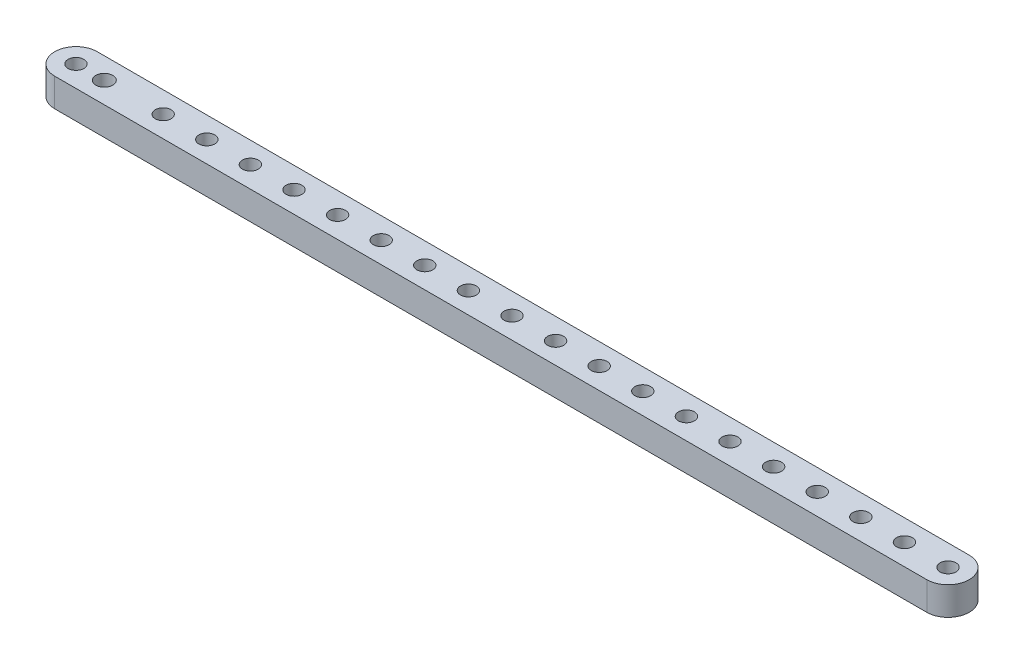
ISO-10303-21;
HEADER;
FILE_DESCRIPTION(('STEP AP214'),'2;1');
FILE_NAME('part.step','',(''),(''),'','','');
FILE_SCHEMA(('AUTOMOTIVE_DESIGN { 1 0 10303 214 1 1 1 1 }'));
ENDSEC;
DATA;
#1=APPLICATION_CONTEXT('core data for automotive mechanical design processes');
#2=APPLICATION_PROTOCOL_DEFINITION('international standard','automotive_design',2000,#1);
#3=PRODUCT_CONTEXT('',#1,'mechanical');
#4=PRODUCT('Part','Part','',(#3));
#5=PRODUCT_RELATED_PRODUCT_CATEGORY('part','',(#4));
#6=PRODUCT_DEFINITION_FORMATION('','',#4);
#7=PRODUCT_DEFINITION_CONTEXT('part definition',#1,'design');
#8=PRODUCT_DEFINITION('design','',#6,#7);
#9=PRODUCT_DEFINITION_SHAPE('','',#8);
#10=(LENGTH_UNIT() NAMED_UNIT(*) SI_UNIT(.MILLI.,.METRE.));
#11=(NAMED_UNIT(*) PLANE_ANGLE_UNIT() SI_UNIT($,.RADIAN.));
#12=(NAMED_UNIT(*) SI_UNIT($,.STERADIAN.) SOLID_ANGLE_UNIT());
#13=UNCERTAINTY_MEASURE_WITH_UNIT(LENGTH_MEASURE(1.E-05),#10,'distance_accuracy_value','');
#14=(GEOMETRIC_REPRESENTATION_CONTEXT(3) GLOBAL_UNCERTAINTY_ASSIGNED_CONTEXT((#13)) GLOBAL_UNIT_ASSIGNED_CONTEXT((#10,
#11,#12)) REPRESENTATION_CONTEXT('',''));
#15=CARTESIAN_POINT('',(0.,0.,0.));
#16=DIRECTION('',(0.,0.,1.));
#17=DIRECTION('',(1.,0.,0.));
#18=AXIS2_PLACEMENT_3D('',#15,#16,#17);
#19=CARTESIAN_POINT('',(97.79,0.,0.));
#20=DIRECTION('',(0.,1.,0.));
#21=DIRECTION('',(0.,0.,1.));
#22=AXIS2_PLACEMENT_3D('',#19,#20,#21);
#23=CYLINDRICAL_SURFACE('',#22,4.76250000000002);
#24=CARTESIAN_POINT('',(97.79,6.35,0.));
#25=DIRECTION('',(0.,1.,0.));
#26=DIRECTION('',(0.,0.,1.));
#27=AXIS2_PLACEMENT_3D('',#24,#25,#26);
#28=CIRCLE('',#27,4.76250000000002);
#29=CARTESIAN_POINT('',(97.79,6.35,4.76250000000003));
#30=VERTEX_POINT('',#29);
#31=CARTESIAN_POINT('',(97.79,6.35,-4.76250000000002));
#32=VERTEX_POINT('',#31);
#33=EDGE_CURVE('E110',#30,#32,#28,.T.);
#34=ORIENTED_EDGE('',*,*,#33,.F.);
#35=DIRECTION('',(0.,1.,0.));
#36=VECTOR('',#35,1.);
#37=CARTESIAN_POINT('',(97.79,0.,4.76250000000003));
#38=LINE('',#37,#36);
#39=CARTESIAN_POINT('',(97.79,0.,4.76250000000003));
#40=VERTEX_POINT('',#39);
#41=EDGE_CURVE('E11',#40,#30,#38,.T.);
#42=ORIENTED_EDGE('',*,*,#41,.F.);
#43=CARTESIAN_POINT('',(97.79,0.,0.));
#44=DIRECTION('',(0.,1.,0.));
#45=DIRECTION('',(0.,0.,1.));
#46=AXIS2_PLACEMENT_3D('',#43,#44,#45);
#47=CIRCLE('',#46,4.76250000000002);
#48=CARTESIAN_POINT('',(97.79,0.,-4.76250000000002));
#49=VERTEX_POINT('',#48);
#50=EDGE_CURVE('E101',#40,#49,#47,.T.);
#51=ORIENTED_EDGE('',*,*,#50,.T.);
#52=DIRECTION('',(0.,1.,0.));
#53=VECTOR('',#52,1.);
#54=CARTESIAN_POINT('',(97.79,0.,-4.76250000000002));
#55=LINE('',#54,#53);
#56=EDGE_CURVE('E42',#49,#32,#55,.T.);
#57=ORIENTED_EDGE('',*,*,#56,.T.);
#58=EDGE_LOOP('',(#34,#42,#51,#57));
#59=FACE_BOUND('',#58,.T.);
#60=ADVANCED_FACE('F39',(#59),#23,.T.);
#61=CARTESIAN_POINT('',(-97.79,0.,4.76250000000003));
#62=DIRECTION('',(0.,0.,1.));
#63=DIRECTION('',(1.,0.,0.));
#64=AXIS2_PLACEMENT_3D('',#61,#62,#63);
#65=PLANE('',#64);
#66=DIRECTION('',(1.,0.,0.));
#67=VECTOR('',#66,1.);
#68=CARTESIAN_POINT('',(-97.79,6.35,4.76250000000003));
#69=LINE('',#68,#67);
#70=CARTESIAN_POINT('',(-97.79,6.35,4.76250000000003));
#71=VERTEX_POINT('',#70);
#72=EDGE_CURVE('E104',#71,#30,#69,.T.);
#73=ORIENTED_EDGE('',*,*,#72,.F.);
#74=DIRECTION('',(0.,1.,0.));
#75=VECTOR('',#74,1.);
#76=CARTESIAN_POINT('',(-97.79,0.,4.76250000000003));
#77=LINE('',#76,#75);
#78=CARTESIAN_POINT('',(-97.79,0.,4.76250000000003));
#79=VERTEX_POINT('',#78);
#80=EDGE_CURVE('E49',#79,#71,#77,.T.);
#81=ORIENTED_EDGE('',*,*,#80,.F.);
#82=DIRECTION('',(1.,0.,0.));
#83=VECTOR('',#82,1.);
#84=CARTESIAN_POINT('',(-97.79,0.,4.76250000000003));
#85=LINE('',#84,#83);
#86=EDGE_CURVE('E96',#79,#40,#85,.T.);
#87=ORIENTED_EDGE('',*,*,#86,.T.);
#88=ORIENTED_EDGE('',*,*,#41,.T.);
#89=EDGE_LOOP('',(#73,#81,#87,#88));
#90=FACE_BOUND('',#89,.T.);
#91=ADVANCED_FACE('F127',(#90),#65,.T.);
#92=CARTESIAN_POINT('',(-97.79,0.,0.));
#93=DIRECTION('',(0.,1.,0.));
#94=DIRECTION('',(0.,0.,1.));
#95=AXIS2_PLACEMENT_3D('',#92,#93,#94);
#96=CYLINDRICAL_SURFACE('',#95,4.76250000000002);
#97=CARTESIAN_POINT('',(-97.79,6.35,0.));
#98=DIRECTION('',(0.,1.,0.));
#99=DIRECTION('',(0.,0.,1.));
#100=AXIS2_PLACEMENT_3D('',#97,#98,#99);
#101=CIRCLE('',#100,4.76250000000002);
#102=CARTESIAN_POINT('',(-97.79,6.35,-4.7625));
#103=VERTEX_POINT('',#102);
#104=EDGE_CURVE('E90',#103,#71,#101,.T.);
#105=ORIENTED_EDGE('',*,*,#104,.F.);
#106=DIRECTION('',(0.,1.,0.));
#107=VECTOR('',#106,1.);
#108=CARTESIAN_POINT('',(-97.79,0.,-4.7625));
#109=LINE('',#108,#107);
#110=CARTESIAN_POINT('',(-97.79,0.,-4.7625));
#111=VERTEX_POINT('',#110);
#112=EDGE_CURVE('E85',#111,#103,#109,.T.);
#113=ORIENTED_EDGE('',*,*,#112,.F.);
#114=CARTESIAN_POINT('',(-97.79,0.,0.));
#115=DIRECTION('',(0.,1.,0.));
#116=DIRECTION('',(0.,0.,1.));
#117=AXIS2_PLACEMENT_3D('',#114,#115,#116);
#118=CIRCLE('',#117,4.76250000000002);
#119=EDGE_CURVE('E88',#111,#79,#118,.T.);
#120=ORIENTED_EDGE('',*,*,#119,.T.);
#121=ORIENTED_EDGE('',*,*,#80,.T.);
#122=EDGE_LOOP('',(#105,#113,#120,#121));
#123=FACE_BOUND('',#122,.T.);
#124=ADVANCED_FACE('F87',(#123),#96,.T.);
#125=CARTESIAN_POINT('',(97.79,0.,-4.76250000000002));
#126=DIRECTION('',(0.,0.,-1.));
#127=DIRECTION('',(-1.,0.,0.));
#128=AXIS2_PLACEMENT_3D('',#125,#126,#127);
#129=PLANE('',#128);
#130=DIRECTION('',(-1.,0.,0.));
#131=VECTOR('',#130,1.);
#132=CARTESIAN_POINT('',(97.79,6.35,-4.76250000000002));
#133=LINE('',#132,#131);
#134=EDGE_CURVE('E114',#32,#103,#133,.T.);
#135=ORIENTED_EDGE('',*,*,#134,.F.);
#136=ORIENTED_EDGE('',*,*,#56,.F.);
#137=DIRECTION('',(-1.,0.,0.));
#138=VECTOR('',#137,1.);
#139=CARTESIAN_POINT('',(97.79,0.,-4.76250000000002));
#140=LINE('',#139,#138);
#141=EDGE_CURVE('E95',#49,#111,#140,.T.);
#142=ORIENTED_EDGE('',*,*,#141,.T.);
#143=ORIENTED_EDGE('',*,*,#112,.T.);
#144=EDGE_LOOP('',(#135,#136,#142,#143));
#145=FACE_BOUND('',#144,.T.);
#146=ADVANCED_FACE('F99',(#145),#129,.T.);
#147=CARTESIAN_POINT('',(97.79,0.,0.));
#148=DIRECTION('',(0.,1.,0.));
#149=DIRECTION('',(0.,0.,1.));
#150=AXIS2_PLACEMENT_3D('',#147,#148,#149);
#151=PLANE('',#150);
#152=CARTESIAN_POINT('',(-91.44,0.,0.));
#153=DIRECTION('',(0.,1.,0.));
#154=DIRECTION('',(0.,0.,1.));
#155=AXIS2_PLACEMENT_3D('',#152,#153,#154);
#156=CIRCLE('',#155,1.90500000000001);
#157=CARTESIAN_POINT('',(-91.44,0.,1.90500000000001));
#158=VERTEX_POINT('',#157);
#159=EDGE_CURVE('E236',#158,#158,#156,.T.);
#160=ORIENTED_EDGE('',*,*,#159,.T.);
#161=EDGE_LOOP('',(#160));
#162=FACE_BOUND('',#161,.T.);
#163=CARTESIAN_POINT('',(-97.79,0.,0.));
#164=DIRECTION('',(0.,1.,0.));
#165=DIRECTION('',(0.,0.,-1.));
#166=AXIS2_PLACEMENT_3D('',#163,#164,#165);
#167=CIRCLE('',#166,1.77799999999997);
#168=CARTESIAN_POINT('',(-97.79,0.,-1.77799999999995));
#169=VERTEX_POINT('',#168);
#170=EDGE_CURVE('E246',#169,#169,#167,.T.);
#171=ORIENTED_EDGE('',*,*,#170,.T.);
#172=EDGE_LOOP('',(#171));
#173=FACE_BOUND('',#172,.T.);
#174=CARTESIAN_POINT('',(-78.232,0.,0.));
#175=DIRECTION('',(0.,1.,0.));
#176=DIRECTION('',(0.,0.,-1.));
#177=AXIS2_PLACEMENT_3D('',#174,#175,#176);
#178=CIRCLE('',#177,1.77799999999999);
#179=CARTESIAN_POINT('',(-78.232,0.,-1.77799999999999));
#180=VERTEX_POINT('',#179);
#181=EDGE_CURVE('E254',#180,#180,#178,.T.);
#182=ORIENTED_EDGE('',*,*,#181,.T.);
#183=EDGE_LOOP('',(#182));
#184=FACE_BOUND('',#183,.T.);
#185=CARTESIAN_POINT('',(-68.453,0.,0.));
#186=DIRECTION('',(0.,1.,0.));
#187=DIRECTION('',(0.,0.,-1.));
#188=AXIS2_PLACEMENT_3D('',#185,#186,#187);
#189=CIRCLE('',#188,1.77799999999999);
#190=CARTESIAN_POINT('',(-68.453,0.,-1.77799999999999));
#191=VERTEX_POINT('',#190);
#192=EDGE_CURVE('E262',#191,#191,#189,.T.);
#193=ORIENTED_EDGE('',*,*,#192,.T.);
#194=EDGE_LOOP('',(#193));
#195=FACE_BOUND('',#194,.T.);
#196=CARTESIAN_POINT('',(-58.674,0.,0.));
#197=DIRECTION('',(0.,1.,0.));
#198=DIRECTION('',(0.,0.,-1.));
#199=AXIS2_PLACEMENT_3D('',#196,#197,#198);
#200=CIRCLE('',#199,1.77799999999999);
#201=CARTESIAN_POINT('',(-58.674,0.,-1.77799999999998));
#202=VERTEX_POINT('',#201);
#203=EDGE_CURVE('E270',#202,#202,#200,.T.);
#204=ORIENTED_EDGE('',*,*,#203,.T.);
#205=EDGE_LOOP('',(#204));
#206=FACE_BOUND('',#205,.T.);
#207=CARTESIAN_POINT('',(-48.895,0.,0.));
#208=DIRECTION('',(0.,1.,0.));
#209=DIRECTION('',(0.,0.,-1.));
#210=AXIS2_PLACEMENT_3D('',#207,#208,#209);
#211=CIRCLE('',#210,1.77799999999999);
#212=CARTESIAN_POINT('',(-48.895,0.,-1.77799999999998));
#213=VERTEX_POINT('',#212);
#214=EDGE_CURVE('E278',#213,#213,#211,.T.);
#215=ORIENTED_EDGE('',*,*,#214,.T.);
#216=EDGE_LOOP('',(#215));
#217=FACE_BOUND('',#216,.T.);
#218=CARTESIAN_POINT('',(-39.116,0.,0.));
#219=DIRECTION('',(0.,1.,0.));
#220=DIRECTION('',(0.,0.,-1.));
#221=AXIS2_PLACEMENT_3D('',#218,#219,#220);
#222=CIRCLE('',#221,1.77799999999999);
#223=CARTESIAN_POINT('',(-39.116,0.,-1.77799999999998));
#224=VERTEX_POINT('',#223);
#225=EDGE_CURVE('E286',#224,#224,#222,.T.);
#226=ORIENTED_EDGE('',*,*,#225,.T.);
#227=EDGE_LOOP('',(#226));
#228=FACE_BOUND('',#227,.T.);
#229=CARTESIAN_POINT('',(-29.337,0.,0.));
#230=DIRECTION('',(0.,1.,0.));
#231=DIRECTION('',(0.,0.,-1.));
#232=AXIS2_PLACEMENT_3D('',#229,#230,#231);
#233=CIRCLE('',#232,1.77799999999999);
#234=CARTESIAN_POINT('',(-29.337,0.,-1.77799999999998));
#235=VERTEX_POINT('',#234);
#236=EDGE_CURVE('E294',#235,#235,#233,.T.);
#237=ORIENTED_EDGE('',*,*,#236,.T.);
#238=EDGE_LOOP('',(#237));
#239=FACE_BOUND('',#238,.T.);
#240=CARTESIAN_POINT('',(-19.558,0.,0.));
#241=DIRECTION('',(0.,1.,0.));
#242=DIRECTION('',(0.,0.,-1.));
#243=AXIS2_PLACEMENT_3D('',#240,#241,#242);
#244=CIRCLE('',#243,1.77799999999999);
#245=CARTESIAN_POINT('',(-19.558,0.,-1.77799999999998));
#246=VERTEX_POINT('',#245);
#247=EDGE_CURVE('E302',#246,#246,#244,.T.);
#248=ORIENTED_EDGE('',*,*,#247,.T.);
#249=EDGE_LOOP('',(#248));
#250=FACE_BOUND('',#249,.T.);
#251=CARTESIAN_POINT('',(-9.77900000000001,0.,0.));
#252=DIRECTION('',(0.,1.,0.));
#253=DIRECTION('',(0.,0.,-1.));
#254=AXIS2_PLACEMENT_3D('',#251,#252,#253);
#255=CIRCLE('',#254,1.77799999999999);
#256=CARTESIAN_POINT('',(-9.77900000000001,0.,-1.77799999999998));
#257=VERTEX_POINT('',#256);
#258=EDGE_CURVE('E310',#257,#257,#255,.T.);
#259=ORIENTED_EDGE('',*,*,#258,.T.);
#260=EDGE_LOOP('',(#259));
#261=FACE_BOUND('',#260,.T.);
#262=CARTESIAN_POINT('',(0.,0.,0.));
#263=DIRECTION('',(0.,1.,0.));
#264=DIRECTION('',(0.,0.,-1.));
#265=AXIS2_PLACEMENT_3D('',#262,#263,#264);
#266=CIRCLE('',#265,1.77799999999999);
#267=CARTESIAN_POINT('',(0.,0.,-1.77799999999998));
#268=VERTEX_POINT('',#267);
#269=EDGE_CURVE('E318',#268,#268,#266,.T.);
#270=ORIENTED_EDGE('',*,*,#269,.T.);
#271=EDGE_LOOP('',(#270));
#272=FACE_BOUND('',#271,.T.);
#273=CARTESIAN_POINT('',(9.779,0.,0.));
#274=DIRECTION('',(0.,1.,0.));
#275=DIRECTION('',(0.,0.,-1.));
#276=AXIS2_PLACEMENT_3D('',#273,#274,#275);
#277=CIRCLE('',#276,1.77799999999999);
#278=CARTESIAN_POINT('',(9.779,0.,-1.77799999999998));
#279=VERTEX_POINT('',#278);
#280=EDGE_CURVE('E326',#279,#279,#277,.T.);
#281=ORIENTED_EDGE('',*,*,#280,.T.);
#282=EDGE_LOOP('',(#281));
#283=FACE_BOUND('',#282,.T.);
#284=CARTESIAN_POINT('',(19.558,0.,0.));
#285=DIRECTION('',(0.,1.,0.));
#286=DIRECTION('',(0.,0.,-1.));
#287=AXIS2_PLACEMENT_3D('',#284,#285,#286);
#288=CIRCLE('',#287,1.77799999999999);
#289=CARTESIAN_POINT('',(19.558,0.,-1.77799999999998));
#290=VERTEX_POINT('',#289);
#291=EDGE_CURVE('E334',#290,#290,#288,.T.);
#292=ORIENTED_EDGE('',*,*,#291,.T.);
#293=EDGE_LOOP('',(#292));
#294=FACE_BOUND('',#293,.T.);
#295=CARTESIAN_POINT('',(29.337,0.,0.));
#296=DIRECTION('',(0.,1.,0.));
#297=DIRECTION('',(0.,0.,-1.));
#298=AXIS2_PLACEMENT_3D('',#295,#296,#297);
#299=CIRCLE('',#298,1.77799999999999);
#300=CARTESIAN_POINT('',(29.337,0.,-1.77799999999998));
#301=VERTEX_POINT('',#300);
#302=EDGE_CURVE('E342',#301,#301,#299,.T.);
#303=ORIENTED_EDGE('',*,*,#302,.T.);
#304=EDGE_LOOP('',(#303));
#305=FACE_BOUND('',#304,.T.);
#306=CARTESIAN_POINT('',(39.116,0.,0.));
#307=DIRECTION('',(0.,1.,0.));
#308=DIRECTION('',(0.,0.,-1.));
#309=AXIS2_PLACEMENT_3D('',#306,#307,#308);
#310=CIRCLE('',#309,1.77799999999999);
#311=CARTESIAN_POINT('',(39.116,0.,-1.77799999999998));
#312=VERTEX_POINT('',#311);
#313=EDGE_CURVE('E350',#312,#312,#310,.T.);
#314=ORIENTED_EDGE('',*,*,#313,.T.);
#315=EDGE_LOOP('',(#314));
#316=FACE_BOUND('',#315,.T.);
#317=CARTESIAN_POINT('',(48.895,0.,0.));
#318=DIRECTION('',(0.,1.,0.));
#319=DIRECTION('',(0.,0.,-1.));
#320=AXIS2_PLACEMENT_3D('',#317,#318,#319);
#321=CIRCLE('',#320,1.77799999999999);
#322=CARTESIAN_POINT('',(48.895,0.,-1.77799999999997));
#323=VERTEX_POINT('',#322);
#324=EDGE_CURVE('E358',#323,#323,#321,.T.);
#325=ORIENTED_EDGE('',*,*,#324,.T.);
#326=EDGE_LOOP('',(#325));
#327=FACE_BOUND('',#326,.T.);
#328=CARTESIAN_POINT('',(58.674,0.,0.));
#329=DIRECTION('',(0.,1.,0.));
#330=DIRECTION('',(0.,0.,-1.));
#331=AXIS2_PLACEMENT_3D('',#328,#329,#330);
#332=CIRCLE('',#331,1.77799999999999);
#333=CARTESIAN_POINT('',(58.674,0.,-1.77799999999997));
#334=VERTEX_POINT('',#333);
#335=EDGE_CURVE('E366',#334,#334,#332,.T.);
#336=ORIENTED_EDGE('',*,*,#335,.T.);
#337=EDGE_LOOP('',(#336));
#338=FACE_BOUND('',#337,.T.);
#339=CARTESIAN_POINT('',(68.453,0.,0.));
#340=DIRECTION('',(0.,1.,0.));
#341=DIRECTION('',(0.,0.,-1.));
#342=AXIS2_PLACEMENT_3D('',#339,#340,#341);
#343=CIRCLE('',#342,1.77799999999999);
#344=CARTESIAN_POINT('',(68.453,0.,-1.77799999999997));
#345=VERTEX_POINT('',#344);
#346=EDGE_CURVE('E374',#345,#345,#343,.T.);
#347=ORIENTED_EDGE('',*,*,#346,.T.);
#348=EDGE_LOOP('',(#347));
#349=FACE_BOUND('',#348,.T.);
#350=CARTESIAN_POINT('',(78.232,0.,0.));
#351=DIRECTION('',(0.,1.,0.));
#352=DIRECTION('',(0.,0.,-1.));
#353=AXIS2_PLACEMENT_3D('',#350,#351,#352);
#354=CIRCLE('',#353,1.77799999999999);
#355=CARTESIAN_POINT('',(78.232,0.,-1.77799999999997));
#356=VERTEX_POINT('',#355);
#357=EDGE_CURVE('E382',#356,#356,#354,.T.);
#358=ORIENTED_EDGE('',*,*,#357,.T.);
#359=EDGE_LOOP('',(#358));
#360=FACE_BOUND('',#359,.T.);
#361=CARTESIAN_POINT('',(88.011,0.,0.));
#362=DIRECTION('',(0.,1.,0.));
#363=DIRECTION('',(0.,0.,-1.));
#364=AXIS2_PLACEMENT_3D('',#361,#362,#363);
#365=CIRCLE('',#364,1.77799999999999);
#366=CARTESIAN_POINT('',(88.011,0.,-1.77799999999997));
#367=VERTEX_POINT('',#366);
#368=EDGE_CURVE('E390',#367,#367,#365,.T.);
#369=ORIENTED_EDGE('',*,*,#368,.T.);
#370=EDGE_LOOP('',(#369));
#371=FACE_BOUND('',#370,.T.);
#372=CARTESIAN_POINT('',(97.79,0.,0.));
#373=DIRECTION('',(0.,1.,0.));
#374=DIRECTION('',(0.,0.,-1.));
#375=AXIS2_PLACEMENT_3D('',#372,#373,#374);
#376=CIRCLE('',#375,1.77799999999999);
#377=CARTESIAN_POINT('',(97.79,0.,-1.77799999999997));
#378=VERTEX_POINT('',#377);
#379=EDGE_CURVE('E115',#378,#378,#376,.T.);
#380=ORIENTED_EDGE('',*,*,#379,.T.);
#381=EDGE_LOOP('',(#380));
#382=FACE_BOUND('',#381,.T.);
#383=ORIENTED_EDGE('',*,*,#50,.F.);
#384=ORIENTED_EDGE('',*,*,#86,.F.);
#385=ORIENTED_EDGE('',*,*,#119,.F.);
#386=ORIENTED_EDGE('',*,*,#141,.F.);
#387=EDGE_LOOP('',(#383,#384,#385,#386));
#388=FACE_BOUND('',#387,.T.);
#389=ADVANCED_FACE('F94',(#162,#173,#184,#195,#206,#217,#228,#239,#250,#261,#272,#283,#294,#305,
#316,#327,#338,#349,#360,#371,#382,#388),#151,.F.);
#390=CARTESIAN_POINT('',(97.79,6.35,0.));
#391=DIRECTION('',(0.,1.,0.));
#392=DIRECTION('',(0.,0.,1.));
#393=AXIS2_PLACEMENT_3D('',#390,#391,#392);
#394=PLANE('',#393);
#395=CARTESIAN_POINT('',(-91.44,6.35,0.));
#396=DIRECTION('',(0.,1.,0.));
#397=DIRECTION('',(0.,0.,1.));
#398=AXIS2_PLACEMENT_3D('',#395,#396,#397);
#399=CIRCLE('',#398,1.90500000000001);
#400=CARTESIAN_POINT('',(-91.44,6.35,1.90500000000001));
#401=VERTEX_POINT('',#400);
#402=EDGE_CURVE('E239',#401,#401,#399,.T.);
#403=ORIENTED_EDGE('',*,*,#402,.F.);
#404=EDGE_LOOP('',(#403));
#405=FACE_BOUND('',#404,.T.);
#406=CARTESIAN_POINT('',(-97.79,6.35,0.));
#407=DIRECTION('',(0.,1.,0.));
#408=DIRECTION('',(0.,0.,-1.));
#409=AXIS2_PLACEMENT_3D('',#406,#407,#408);
#410=CIRCLE('',#409,1.77799999999997);
#411=CARTESIAN_POINT('',(-97.79,6.35,-1.77799999999995));
#412=VERTEX_POINT('',#411);
#413=EDGE_CURVE('E243',#412,#412,#410,.T.);
#414=ORIENTED_EDGE('',*,*,#413,.F.);
#415=EDGE_LOOP('',(#414));
#416=FACE_BOUND('',#415,.T.);
#417=CARTESIAN_POINT('',(-78.232,6.35,0.));
#418=DIRECTION('',(0.,1.,0.));
#419=DIRECTION('',(0.,0.,-1.));
#420=AXIS2_PLACEMENT_3D('',#417,#418,#419);
#421=CIRCLE('',#420,1.77799999999999);
#422=CARTESIAN_POINT('',(-78.232,6.35,-1.77799999999999));
#423=VERTEX_POINT('',#422);
#424=EDGE_CURVE('E250',#423,#423,#421,.T.);
#425=ORIENTED_EDGE('',*,*,#424,.F.);
#426=EDGE_LOOP('',(#425));
#427=FACE_BOUND('',#426,.T.);
#428=CARTESIAN_POINT('',(-68.453,6.35,0.));
#429=DIRECTION('',(0.,1.,0.));
#430=DIRECTION('',(0.,0.,-1.));
#431=AXIS2_PLACEMENT_3D('',#428,#429,#430);
#432=CIRCLE('',#431,1.77799999999999);
#433=CARTESIAN_POINT('',(-68.453,6.35,-1.77799999999999));
#434=VERTEX_POINT('',#433);
#435=EDGE_CURVE('E258',#434,#434,#432,.T.);
#436=ORIENTED_EDGE('',*,*,#435,.F.);
#437=EDGE_LOOP('',(#436));
#438=FACE_BOUND('',#437,.T.);
#439=CARTESIAN_POINT('',(-58.674,6.35,0.));
#440=DIRECTION('',(0.,1.,0.));
#441=DIRECTION('',(0.,0.,-1.));
#442=AXIS2_PLACEMENT_3D('',#439,#440,#441);
#443=CIRCLE('',#442,1.77799999999999);
#444=CARTESIAN_POINT('',(-58.674,6.35,-1.77799999999998));
#445=VERTEX_POINT('',#444);
#446=EDGE_CURVE('E266',#445,#445,#443,.T.);
#447=ORIENTED_EDGE('',*,*,#446,.F.);
#448=EDGE_LOOP('',(#447));
#449=FACE_BOUND('',#448,.T.);
#450=CARTESIAN_POINT('',(-48.895,6.35,0.));
#451=DIRECTION('',(0.,1.,0.));
#452=DIRECTION('',(0.,0.,-1.));
#453=AXIS2_PLACEMENT_3D('',#450,#451,#452);
#454=CIRCLE('',#453,1.77799999999999);
#455=CARTESIAN_POINT('',(-48.895,6.35,-1.77799999999998));
#456=VERTEX_POINT('',#455);
#457=EDGE_CURVE('E274',#456,#456,#454,.T.);
#458=ORIENTED_EDGE('',*,*,#457,.F.);
#459=EDGE_LOOP('',(#458));
#460=FACE_BOUND('',#459,.T.);
#461=CARTESIAN_POINT('',(-39.116,6.35,0.));
#462=DIRECTION('',(0.,1.,0.));
#463=DIRECTION('',(0.,0.,-1.));
#464=AXIS2_PLACEMENT_3D('',#461,#462,#463);
#465=CIRCLE('',#464,1.77799999999999);
#466=CARTESIAN_POINT('',(-39.116,6.35,-1.77799999999998));
#467=VERTEX_POINT('',#466);
#468=EDGE_CURVE('E282',#467,#467,#465,.T.);
#469=ORIENTED_EDGE('',*,*,#468,.F.);
#470=EDGE_LOOP('',(#469));
#471=FACE_BOUND('',#470,.T.);
#472=CARTESIAN_POINT('',(-29.337,6.35,0.));
#473=DIRECTION('',(0.,1.,0.));
#474=DIRECTION('',(0.,0.,-1.));
#475=AXIS2_PLACEMENT_3D('',#472,#473,#474);
#476=CIRCLE('',#475,1.77799999999999);
#477=CARTESIAN_POINT('',(-29.337,6.35,-1.77799999999998));
#478=VERTEX_POINT('',#477);
#479=EDGE_CURVE('E290',#478,#478,#476,.T.);
#480=ORIENTED_EDGE('',*,*,#479,.F.);
#481=EDGE_LOOP('',(#480));
#482=FACE_BOUND('',#481,.T.);
#483=CARTESIAN_POINT('',(-19.558,6.35,0.));
#484=DIRECTION('',(0.,1.,0.));
#485=DIRECTION('',(0.,0.,-1.));
#486=AXIS2_PLACEMENT_3D('',#483,#484,#485);
#487=CIRCLE('',#486,1.77799999999999);
#488=CARTESIAN_POINT('',(-19.558,6.35,-1.77799999999998));
#489=VERTEX_POINT('',#488);
#490=EDGE_CURVE('E298',#489,#489,#487,.T.);
#491=ORIENTED_EDGE('',*,*,#490,.F.);
#492=EDGE_LOOP('',(#491));
#493=FACE_BOUND('',#492,.T.);
#494=CARTESIAN_POINT('',(-9.77900000000001,6.35,0.));
#495=DIRECTION('',(0.,1.,0.));
#496=DIRECTION('',(0.,0.,-1.));
#497=AXIS2_PLACEMENT_3D('',#494,#495,#496);
#498=CIRCLE('',#497,1.77799999999999);
#499=CARTESIAN_POINT('',(-9.77900000000001,6.35,-1.77799999999998));
#500=VERTEX_POINT('',#499);
#501=EDGE_CURVE('E306',#500,#500,#498,.T.);
#502=ORIENTED_EDGE('',*,*,#501,.F.);
#503=EDGE_LOOP('',(#502));
#504=FACE_BOUND('',#503,.T.);
#505=CARTESIAN_POINT('',(0.,6.35,0.));
#506=DIRECTION('',(0.,1.,0.));
#507=DIRECTION('',(0.,0.,-1.));
#508=AXIS2_PLACEMENT_3D('',#505,#506,#507);
#509=CIRCLE('',#508,1.77799999999999);
#510=CARTESIAN_POINT('',(0.,6.35,-1.77799999999998));
#511=VERTEX_POINT('',#510);
#512=EDGE_CURVE('E314',#511,#511,#509,.T.);
#513=ORIENTED_EDGE('',*,*,#512,.F.);
#514=EDGE_LOOP('',(#513));
#515=FACE_BOUND('',#514,.T.);
#516=CARTESIAN_POINT('',(9.779,6.35,0.));
#517=DIRECTION('',(0.,1.,0.));
#518=DIRECTION('',(0.,0.,-1.));
#519=AXIS2_PLACEMENT_3D('',#516,#517,#518);
#520=CIRCLE('',#519,1.77799999999999);
#521=CARTESIAN_POINT('',(9.779,6.35,-1.77799999999998));
#522=VERTEX_POINT('',#521);
#523=EDGE_CURVE('E322',#522,#522,#520,.T.);
#524=ORIENTED_EDGE('',*,*,#523,.F.);
#525=EDGE_LOOP('',(#524));
#526=FACE_BOUND('',#525,.T.);
#527=CARTESIAN_POINT('',(19.558,6.35,0.));
#528=DIRECTION('',(0.,1.,0.));
#529=DIRECTION('',(0.,0.,-1.));
#530=AXIS2_PLACEMENT_3D('',#527,#528,#529);
#531=CIRCLE('',#530,1.77799999999999);
#532=CARTESIAN_POINT('',(19.558,6.35,-1.77799999999998));
#533=VERTEX_POINT('',#532);
#534=EDGE_CURVE('E330',#533,#533,#531,.T.);
#535=ORIENTED_EDGE('',*,*,#534,.F.);
#536=EDGE_LOOP('',(#535));
#537=FACE_BOUND('',#536,.T.);
#538=CARTESIAN_POINT('',(29.337,6.35,0.));
#539=DIRECTION('',(0.,1.,0.));
#540=DIRECTION('',(0.,0.,-1.));
#541=AXIS2_PLACEMENT_3D('',#538,#539,#540);
#542=CIRCLE('',#541,1.77799999999999);
#543=CARTESIAN_POINT('',(29.337,6.35,-1.77799999999998));
#544=VERTEX_POINT('',#543);
#545=EDGE_CURVE('E338',#544,#544,#542,.T.);
#546=ORIENTED_EDGE('',*,*,#545,.F.);
#547=EDGE_LOOP('',(#546));
#548=FACE_BOUND('',#547,.T.);
#549=CARTESIAN_POINT('',(39.116,6.35,0.));
#550=DIRECTION('',(0.,1.,0.));
#551=DIRECTION('',(0.,0.,-1.));
#552=AXIS2_PLACEMENT_3D('',#549,#550,#551);
#553=CIRCLE('',#552,1.77799999999999);
#554=CARTESIAN_POINT('',(39.116,6.35,-1.77799999999998));
#555=VERTEX_POINT('',#554);
#556=EDGE_CURVE('E346',#555,#555,#553,.T.);
#557=ORIENTED_EDGE('',*,*,#556,.F.);
#558=EDGE_LOOP('',(#557));
#559=FACE_BOUND('',#558,.T.);
#560=CARTESIAN_POINT('',(48.895,6.35,0.));
#561=DIRECTION('',(0.,1.,0.));
#562=DIRECTION('',(0.,0.,-1.));
#563=AXIS2_PLACEMENT_3D('',#560,#561,#562);
#564=CIRCLE('',#563,1.77799999999999);
#565=CARTESIAN_POINT('',(48.895,6.35,-1.77799999999997));
#566=VERTEX_POINT('',#565);
#567=EDGE_CURVE('E354',#566,#566,#564,.T.);
#568=ORIENTED_EDGE('',*,*,#567,.F.);
#569=EDGE_LOOP('',(#568));
#570=FACE_BOUND('',#569,.T.);
#571=CARTESIAN_POINT('',(58.674,6.35,0.));
#572=DIRECTION('',(0.,1.,0.));
#573=DIRECTION('',(0.,0.,-1.));
#574=AXIS2_PLACEMENT_3D('',#571,#572,#573);
#575=CIRCLE('',#574,1.77799999999999);
#576=CARTESIAN_POINT('',(58.674,6.35,-1.77799999999997));
#577=VERTEX_POINT('',#576);
#578=EDGE_CURVE('E362',#577,#577,#575,.T.);
#579=ORIENTED_EDGE('',*,*,#578,.F.);
#580=EDGE_LOOP('',(#579));
#581=FACE_BOUND('',#580,.T.);
#582=CARTESIAN_POINT('',(68.453,6.35,0.));
#583=DIRECTION('',(0.,1.,0.));
#584=DIRECTION('',(0.,0.,-1.));
#585=AXIS2_PLACEMENT_3D('',#582,#583,#584);
#586=CIRCLE('',#585,1.77799999999999);
#587=CARTESIAN_POINT('',(68.453,6.35,-1.77799999999997));
#588=VERTEX_POINT('',#587);
#589=EDGE_CURVE('E370',#588,#588,#586,.T.);
#590=ORIENTED_EDGE('',*,*,#589,.F.);
#591=EDGE_LOOP('',(#590));
#592=FACE_BOUND('',#591,.T.);
#593=CARTESIAN_POINT('',(78.232,6.35,0.));
#594=DIRECTION('',(0.,1.,0.));
#595=DIRECTION('',(0.,0.,-1.));
#596=AXIS2_PLACEMENT_3D('',#593,#594,#595);
#597=CIRCLE('',#596,1.77799999999999);
#598=CARTESIAN_POINT('',(78.232,6.35,-1.77799999999997));
#599=VERTEX_POINT('',#598);
#600=EDGE_CURVE('E378',#599,#599,#597,.T.);
#601=ORIENTED_EDGE('',*,*,#600,.F.);
#602=EDGE_LOOP('',(#601));
#603=FACE_BOUND('',#602,.T.);
#604=CARTESIAN_POINT('',(88.011,6.35,0.));
#605=DIRECTION('',(0.,1.,0.));
#606=DIRECTION('',(0.,0.,-1.));
#607=AXIS2_PLACEMENT_3D('',#604,#605,#606);
#608=CIRCLE('',#607,1.77799999999999);
#609=CARTESIAN_POINT('',(88.011,6.35,-1.77799999999997));
#610=VERTEX_POINT('',#609);
#611=EDGE_CURVE('E386',#610,#610,#608,.T.);
#612=ORIENTED_EDGE('',*,*,#611,.F.);
#613=EDGE_LOOP('',(#612));
#614=FACE_BOUND('',#613,.T.);
#615=CARTESIAN_POINT('',(97.79,6.35,0.));
#616=DIRECTION('',(0.,1.,0.));
#617=DIRECTION('',(0.,0.,-1.));
#618=AXIS2_PLACEMENT_3D('',#615,#616,#617);
#619=CIRCLE('',#618,1.77799999999999);
#620=CARTESIAN_POINT('',(97.79,6.35,-1.77799999999997));
#621=VERTEX_POINT('',#620);
#622=EDGE_CURVE('E394',#621,#621,#619,.T.);
#623=ORIENTED_EDGE('',*,*,#622,.F.);
#624=EDGE_LOOP('',(#623));
#625=FACE_BOUND('',#624,.T.);
#626=ORIENTED_EDGE('',*,*,#33,.T.);
#627=ORIENTED_EDGE('',*,*,#134,.T.);
#628=ORIENTED_EDGE('',*,*,#104,.T.);
#629=ORIENTED_EDGE('',*,*,#72,.T.);
#630=EDGE_LOOP('',(#626,#627,#628,#629));
#631=FACE_BOUND('',#630,.T.);
#632=ADVANCED_FACE('F126',(#405,#416,#427,#438,#449,#460,#471,#482,#493,#504,#515,#526,#537,
#548,#559,#570,#581,#592,#603,#614,#625,#631),#394,.T.);
#633=CARTESIAN_POINT('',(97.79,0.,0.));
#634=DIRECTION('',(0.,1.,0.));
#635=DIRECTION('',(0.,0.,1.));
#636=AXIS2_PLACEMENT_3D('',#633,#634,#635);
#637=CYLINDRICAL_SURFACE('',#636,1.77799999999999);
#638=ORIENTED_EDGE('',*,*,#379,.F.);
#639=EDGE_LOOP('',(#638));
#640=FACE_BOUND('',#639,.T.);
#641=ORIENTED_EDGE('',*,*,#622,.T.);
#642=EDGE_LOOP('',(#641));
#643=FACE_BOUND('',#642,.T.);
#644=ADVANCED_FACE('F147',(#640,#643),#637,.F.);
#645=CARTESIAN_POINT('',(88.011,0.,0.));
#646=DIRECTION('',(0.,1.,0.));
#647=DIRECTION('',(0.,0.,1.));
#648=AXIS2_PLACEMENT_3D('',#645,#646,#647);
#649=CYLINDRICAL_SURFACE('',#648,1.77799999999999);
#650=ORIENTED_EDGE('',*,*,#368,.F.);
#651=EDGE_LOOP('',(#650));
#652=FACE_BOUND('',#651,.T.);
#653=ORIENTED_EDGE('',*,*,#611,.T.);
#654=EDGE_LOOP('',(#653));
#655=FACE_BOUND('',#654,.T.);
#656=ADVANCED_FACE('F153',(#652,#655),#649,.F.);
#657=CARTESIAN_POINT('',(78.232,0.,0.));
#658=DIRECTION('',(0.,1.,0.));
#659=DIRECTION('',(0.,0.,1.));
#660=AXIS2_PLACEMENT_3D('',#657,#658,#659);
#661=CYLINDRICAL_SURFACE('',#660,1.77799999999999);
#662=ORIENTED_EDGE('',*,*,#357,.F.);
#663=EDGE_LOOP('',(#662));
#664=FACE_BOUND('',#663,.T.);
#665=ORIENTED_EDGE('',*,*,#600,.T.);
#666=EDGE_LOOP('',(#665));
#667=FACE_BOUND('',#666,.T.);
#668=ADVANCED_FACE('F157',(#664,#667),#661,.F.);
#669=CARTESIAN_POINT('',(68.453,0.,0.));
#670=DIRECTION('',(0.,1.,0.));
#671=DIRECTION('',(0.,0.,1.));
#672=AXIS2_PLACEMENT_3D('',#669,#670,#671);
#673=CYLINDRICAL_SURFACE('',#672,1.77799999999999);
#674=ORIENTED_EDGE('',*,*,#346,.F.);
#675=EDGE_LOOP('',(#674));
#676=FACE_BOUND('',#675,.T.);
#677=ORIENTED_EDGE('',*,*,#589,.T.);
#678=EDGE_LOOP('',(#677));
#679=FACE_BOUND('',#678,.T.);
#680=ADVANCED_FACE('F161',(#676,#679),#673,.F.);
#681=CARTESIAN_POINT('',(58.674,0.,0.));
#682=DIRECTION('',(0.,1.,0.));
#683=DIRECTION('',(0.,0.,1.));
#684=AXIS2_PLACEMENT_3D('',#681,#682,#683);
#685=CYLINDRICAL_SURFACE('',#684,1.77799999999999);
#686=ORIENTED_EDGE('',*,*,#335,.F.);
#687=EDGE_LOOP('',(#686));
#688=FACE_BOUND('',#687,.T.);
#689=ORIENTED_EDGE('',*,*,#578,.T.);
#690=EDGE_LOOP('',(#689));
#691=FACE_BOUND('',#690,.T.);
#692=ADVANCED_FACE('F165',(#688,#691),#685,.F.);
#693=CARTESIAN_POINT('',(48.895,0.,0.));
#694=DIRECTION('',(0.,1.,0.));
#695=DIRECTION('',(0.,0.,1.));
#696=AXIS2_PLACEMENT_3D('',#693,#694,#695);
#697=CYLINDRICAL_SURFACE('',#696,1.77799999999999);
#698=ORIENTED_EDGE('',*,*,#324,.F.);
#699=EDGE_LOOP('',(#698));
#700=FACE_BOUND('',#699,.T.);
#701=ORIENTED_EDGE('',*,*,#567,.T.);
#702=EDGE_LOOP('',(#701));
#703=FACE_BOUND('',#702,.T.);
#704=ADVANCED_FACE('F169',(#700,#703),#697,.F.);
#705=CARTESIAN_POINT('',(39.116,0.,0.));
#706=DIRECTION('',(0.,1.,0.));
#707=DIRECTION('',(0.,0.,1.));
#708=AXIS2_PLACEMENT_3D('',#705,#706,#707);
#709=CYLINDRICAL_SURFACE('',#708,1.77799999999999);
#710=ORIENTED_EDGE('',*,*,#313,.F.);
#711=EDGE_LOOP('',(#710));
#712=FACE_BOUND('',#711,.T.);
#713=ORIENTED_EDGE('',*,*,#556,.T.);
#714=EDGE_LOOP('',(#713));
#715=FACE_BOUND('',#714,.T.);
#716=ADVANCED_FACE('F173',(#712,#715),#709,.F.);
#717=CARTESIAN_POINT('',(29.337,0.,0.));
#718=DIRECTION('',(0.,1.,0.));
#719=DIRECTION('',(0.,0.,1.));
#720=AXIS2_PLACEMENT_3D('',#717,#718,#719);
#721=CYLINDRICAL_SURFACE('',#720,1.77799999999999);
#722=ORIENTED_EDGE('',*,*,#302,.F.);
#723=EDGE_LOOP('',(#722));
#724=FACE_BOUND('',#723,.T.);
#725=ORIENTED_EDGE('',*,*,#545,.T.);
#726=EDGE_LOOP('',(#725));
#727=FACE_BOUND('',#726,.T.);
#728=ADVANCED_FACE('F177',(#724,#727),#721,.F.);
#729=CARTESIAN_POINT('',(19.558,0.,0.));
#730=DIRECTION('',(0.,1.,0.));
#731=DIRECTION('',(0.,0.,1.));
#732=AXIS2_PLACEMENT_3D('',#729,#730,#731);
#733=CYLINDRICAL_SURFACE('',#732,1.77799999999999);
#734=ORIENTED_EDGE('',*,*,#291,.F.);
#735=EDGE_LOOP('',(#734));
#736=FACE_BOUND('',#735,.T.);
#737=ORIENTED_EDGE('',*,*,#534,.T.);
#738=EDGE_LOOP('',(#737));
#739=FACE_BOUND('',#738,.T.);
#740=ADVANCED_FACE('F181',(#736,#739),#733,.F.);
#741=CARTESIAN_POINT('',(9.779,0.,0.));
#742=DIRECTION('',(0.,1.,0.));
#743=DIRECTION('',(0.,0.,1.));
#744=AXIS2_PLACEMENT_3D('',#741,#742,#743);
#745=CYLINDRICAL_SURFACE('',#744,1.77799999999999);
#746=ORIENTED_EDGE('',*,*,#280,.F.);
#747=EDGE_LOOP('',(#746));
#748=FACE_BOUND('',#747,.T.);
#749=ORIENTED_EDGE('',*,*,#523,.T.);
#750=EDGE_LOOP('',(#749));
#751=FACE_BOUND('',#750,.T.);
#752=ADVANCED_FACE('F185',(#748,#751),#745,.F.);
#753=CARTESIAN_POINT('',(0.,0.,0.));
#754=DIRECTION('',(0.,1.,0.));
#755=DIRECTION('',(0.,0.,1.));
#756=AXIS2_PLACEMENT_3D('',#753,#754,#755);
#757=CYLINDRICAL_SURFACE('',#756,1.77799999999999);
#758=ORIENTED_EDGE('',*,*,#269,.F.);
#759=EDGE_LOOP('',(#758));
#760=FACE_BOUND('',#759,.T.);
#761=ORIENTED_EDGE('',*,*,#512,.T.);
#762=EDGE_LOOP('',(#761));
#763=FACE_BOUND('',#762,.T.);
#764=ADVANCED_FACE('F189',(#760,#763),#757,.F.);
#765=CARTESIAN_POINT('',(-9.77900000000001,0.,0.));
#766=DIRECTION('',(0.,1.,0.));
#767=DIRECTION('',(0.,0.,1.));
#768=AXIS2_PLACEMENT_3D('',#765,#766,#767);
#769=CYLINDRICAL_SURFACE('',#768,1.77799999999999);
#770=ORIENTED_EDGE('',*,*,#258,.F.);
#771=EDGE_LOOP('',(#770));
#772=FACE_BOUND('',#771,.T.);
#773=ORIENTED_EDGE('',*,*,#501,.T.);
#774=EDGE_LOOP('',(#773));
#775=FACE_BOUND('',#774,.T.);
#776=ADVANCED_FACE('F193',(#772,#775),#769,.F.);
#777=CARTESIAN_POINT('',(-19.558,0.,0.));
#778=DIRECTION('',(0.,1.,0.));
#779=DIRECTION('',(0.,0.,1.));
#780=AXIS2_PLACEMENT_3D('',#777,#778,#779);
#781=CYLINDRICAL_SURFACE('',#780,1.77799999999999);
#782=ORIENTED_EDGE('',*,*,#247,.F.);
#783=EDGE_LOOP('',(#782));
#784=FACE_BOUND('',#783,.T.);
#785=ORIENTED_EDGE('',*,*,#490,.T.);
#786=EDGE_LOOP('',(#785));
#787=FACE_BOUND('',#786,.T.);
#788=ADVANCED_FACE('F197',(#784,#787),#781,.F.);
#789=CARTESIAN_POINT('',(-29.337,0.,0.));
#790=DIRECTION('',(0.,1.,0.));
#791=DIRECTION('',(0.,0.,1.));
#792=AXIS2_PLACEMENT_3D('',#789,#790,#791);
#793=CYLINDRICAL_SURFACE('',#792,1.77799999999999);
#794=ORIENTED_EDGE('',*,*,#236,.F.);
#795=EDGE_LOOP('',(#794));
#796=FACE_BOUND('',#795,.T.);
#797=ORIENTED_EDGE('',*,*,#479,.T.);
#798=EDGE_LOOP('',(#797));
#799=FACE_BOUND('',#798,.T.);
#800=ADVANCED_FACE('F201',(#796,#799),#793,.F.);
#801=CARTESIAN_POINT('',(-39.116,0.,0.));
#802=DIRECTION('',(0.,1.,0.));
#803=DIRECTION('',(0.,0.,1.));
#804=AXIS2_PLACEMENT_3D('',#801,#802,#803);
#805=CYLINDRICAL_SURFACE('',#804,1.77799999999999);
#806=ORIENTED_EDGE('',*,*,#225,.F.);
#807=EDGE_LOOP('',(#806));
#808=FACE_BOUND('',#807,.T.);
#809=ORIENTED_EDGE('',*,*,#468,.T.);
#810=EDGE_LOOP('',(#809));
#811=FACE_BOUND('',#810,.T.);
#812=ADVANCED_FACE('F205',(#808,#811),#805,.F.);
#813=CARTESIAN_POINT('',(-48.895,0.,0.));
#814=DIRECTION('',(0.,1.,0.));
#815=DIRECTION('',(0.,0.,1.));
#816=AXIS2_PLACEMENT_3D('',#813,#814,#815);
#817=CYLINDRICAL_SURFACE('',#816,1.77799999999999);
#818=ORIENTED_EDGE('',*,*,#214,.F.);
#819=EDGE_LOOP('',(#818));
#820=FACE_BOUND('',#819,.T.);
#821=ORIENTED_EDGE('',*,*,#457,.T.);
#822=EDGE_LOOP('',(#821));
#823=FACE_BOUND('',#822,.T.);
#824=ADVANCED_FACE('F209',(#820,#823),#817,.F.);
#825=CARTESIAN_POINT('',(-58.674,0.,0.));
#826=DIRECTION('',(0.,1.,0.));
#827=DIRECTION('',(0.,0.,1.));
#828=AXIS2_PLACEMENT_3D('',#825,#826,#827);
#829=CYLINDRICAL_SURFACE('',#828,1.77799999999999);
#830=ORIENTED_EDGE('',*,*,#203,.F.);
#831=EDGE_LOOP('',(#830));
#832=FACE_BOUND('',#831,.T.);
#833=ORIENTED_EDGE('',*,*,#446,.T.);
#834=EDGE_LOOP('',(#833));
#835=FACE_BOUND('',#834,.T.);
#836=ADVANCED_FACE('F213',(#832,#835),#829,.F.);
#837=CARTESIAN_POINT('',(-68.453,0.,0.));
#838=DIRECTION('',(0.,1.,0.));
#839=DIRECTION('',(0.,0.,1.));
#840=AXIS2_PLACEMENT_3D('',#837,#838,#839);
#841=CYLINDRICAL_SURFACE('',#840,1.77799999999999);
#842=ORIENTED_EDGE('',*,*,#192,.F.);
#843=EDGE_LOOP('',(#842));
#844=FACE_BOUND('',#843,.T.);
#845=ORIENTED_EDGE('',*,*,#435,.T.);
#846=EDGE_LOOP('',(#845));
#847=FACE_BOUND('',#846,.T.);
#848=ADVANCED_FACE('F217',(#844,#847),#841,.F.);
#849=CARTESIAN_POINT('',(-78.232,0.,0.));
#850=DIRECTION('',(0.,1.,0.));
#851=DIRECTION('',(0.,0.,1.));
#852=AXIS2_PLACEMENT_3D('',#849,#850,#851);
#853=CYLINDRICAL_SURFACE('',#852,1.77799999999999);
#854=ORIENTED_EDGE('',*,*,#181,.F.);
#855=EDGE_LOOP('',(#854));
#856=FACE_BOUND('',#855,.T.);
#857=ORIENTED_EDGE('',*,*,#424,.T.);
#858=EDGE_LOOP('',(#857));
#859=FACE_BOUND('',#858,.T.);
#860=ADVANCED_FACE('F221',(#856,#859),#853,.F.);
#861=CARTESIAN_POINT('',(-97.79,0.,0.));
#862=DIRECTION('',(0.,1.,0.));
#863=DIRECTION('',(0.,0.,1.));
#864=AXIS2_PLACEMENT_3D('',#861,#862,#863);
#865=CYLINDRICAL_SURFACE('',#864,1.77799999999997);
#866=ORIENTED_EDGE('',*,*,#170,.F.);
#867=EDGE_LOOP('',(#866));
#868=FACE_BOUND('',#867,.T.);
#869=ORIENTED_EDGE('',*,*,#413,.T.);
#870=EDGE_LOOP('',(#869));
#871=FACE_BOUND('',#870,.T.);
#872=ADVANCED_FACE('F225',(#868,#871),#865,.F.);
#873=CARTESIAN_POINT('',(-91.44,0.,0.));
#874=DIRECTION('',(0.,1.,0.));
#875=DIRECTION('',(0.,0.,1.));
#876=AXIS2_PLACEMENT_3D('',#873,#874,#875);
#877=CYLINDRICAL_SURFACE('',#876,1.90500000000001);
#878=ORIENTED_EDGE('',*,*,#159,.F.);
#879=EDGE_LOOP('',(#878));
#880=FACE_BOUND('',#879,.T.);
#881=ORIENTED_EDGE('',*,*,#402,.T.);
#882=EDGE_LOOP('',(#881));
#883=FACE_BOUND('',#882,.T.);
#884=ADVANCED_FACE('F228',(#880,#883),#877,.F.);
#885=CLOSED_SHELL('',(#60,#91,#124,#146,#389,#632,#644,#656,#668,#680,#692,#704,#716,#728,#740,
#752,#764,#776,#788,#800,#812,#824,#836,#848,#860,#872,#884));
#886=MANIFOLD_SOLID_BREP('B2',#885);
#887=ADVANCED_BREP_SHAPE_REPRESENTATION('',(#18,#886),#14);
#888=SHAPE_DEFINITION_REPRESENTATION(#9,#887);
ENDSEC;
END-ISO-10303-21;
